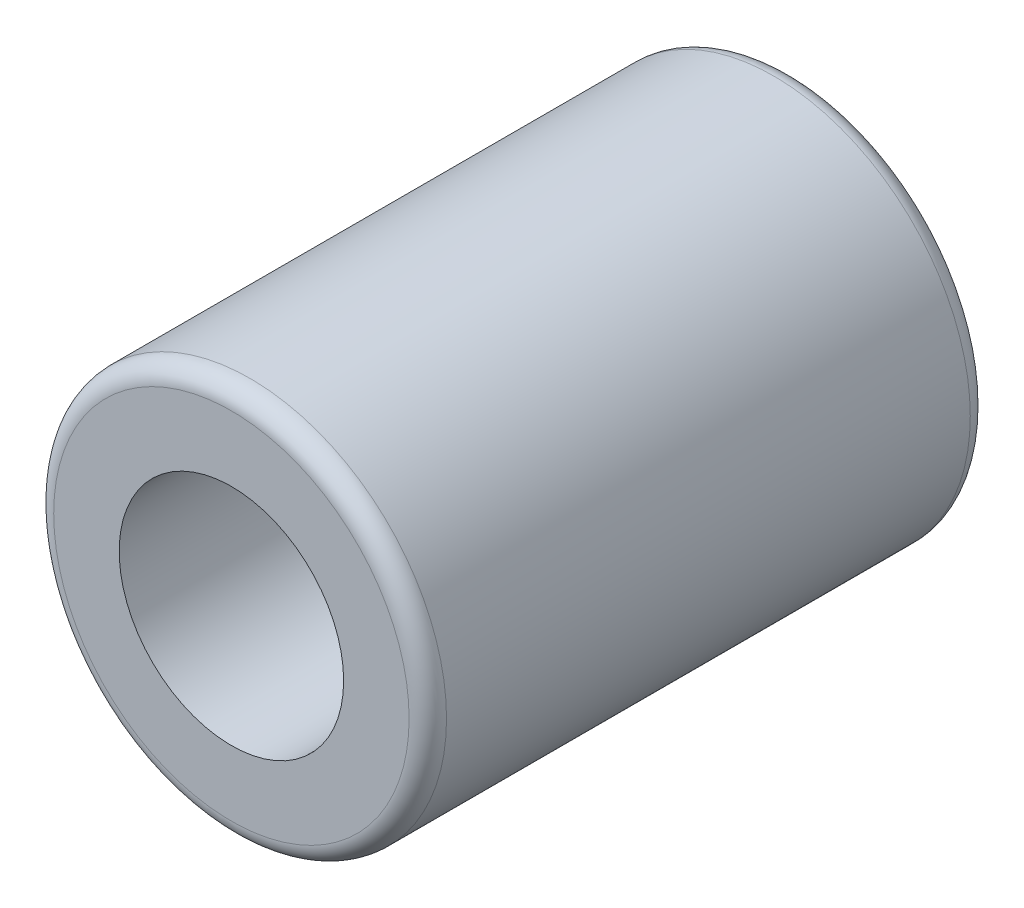
ISO-10303-21;
HEADER;
FILE_DESCRIPTION(('STEP AP214'),'2;1');
FILE_NAME('part.step','',(''),(''),'','','');
FILE_SCHEMA(('AUTOMOTIVE_DESIGN { 1 0 10303 214 1 1 1 1 }'));
ENDSEC;
DATA;
#1=APPLICATION_CONTEXT('core data for automotive mechanical design processes');
#2=APPLICATION_PROTOCOL_DEFINITION('international standard','automotive_design',2000,#1);
#3=PRODUCT_CONTEXT('',#1,'mechanical');
#4=PRODUCT('Part','Part','',(#3));
#5=PRODUCT_RELATED_PRODUCT_CATEGORY('part','',(#4));
#6=PRODUCT_DEFINITION_FORMATION('','',#4);
#7=PRODUCT_DEFINITION_CONTEXT('part definition',#1,'design');
#8=PRODUCT_DEFINITION('design','',#6,#7);
#9=PRODUCT_DEFINITION_SHAPE('','',#8);
#10=(LENGTH_UNIT() NAMED_UNIT(*) SI_UNIT(.MILLI.,.METRE.));
#11=(NAMED_UNIT(*) PLANE_ANGLE_UNIT() SI_UNIT($,.RADIAN.));
#12=(NAMED_UNIT(*) SI_UNIT($,.STERADIAN.) SOLID_ANGLE_UNIT());
#13=UNCERTAINTY_MEASURE_WITH_UNIT(LENGTH_MEASURE(1.E-05),#10,'distance_accuracy_value','');
#14=(GEOMETRIC_REPRESENTATION_CONTEXT(3) GLOBAL_UNCERTAINTY_ASSIGNED_CONTEXT((#13)) GLOBAL_UNIT_ASSIGNED_CONTEXT((#10,
#11,#12)) REPRESENTATION_CONTEXT('',''));
#15=CARTESIAN_POINT('',(0.,0.,0.));
#16=DIRECTION('',(0.,0.,1.));
#17=DIRECTION('',(1.,0.,0.));
#18=AXIS2_PLACEMENT_3D('',#15,#16,#17);
#19=CARTESIAN_POINT('',(0.,0.,30.));
#20=DIRECTION('',(0.,0.,1.));
#21=DIRECTION('',(1.,0.,0.));
#22=AXIS2_PLACEMENT_3D('',#19,#20,#21);
#23=PLANE('',#22);
#24=CARTESIAN_POINT('',(0.,0.,30.));
#25=DIRECTION('',(0.,0.,1.));
#26=DIRECTION('',(1.,0.,0.));
#27=AXIS2_PLACEMENT_3D('',#24,#25,#26);
#28=CIRCLE('',#27,9.5);
#29=CARTESIAN_POINT('',(9.5,0.,30.));
#30=VERTEX_POINT('',#29);
#31=EDGE_CURVE('E60',#30,#30,#28,.T.);
#32=ORIENTED_EDGE('',*,*,#31,.T.);
#33=EDGE_LOOP('',(#32));
#34=FACE_BOUND('',#33,.T.);
#35=CARTESIAN_POINT('',(0.,0.,30.));
#36=DIRECTION('',(0.,0.,1.));
#37=DIRECTION('',(1.,0.,0.));
#38=AXIS2_PLACEMENT_3D('',#35,#36,#37);
#39=CIRCLE('',#38,6.);
#40=CARTESIAN_POINT('',(6.,0.,30.));
#41=VERTEX_POINT('',#40);
#42=EDGE_CURVE('E65',#41,#41,#39,.T.);
#43=ORIENTED_EDGE('',*,*,#42,.F.);
#44=EDGE_LOOP('',(#43));
#45=FACE_BOUND('',#44,.T.);
#46=ADVANCED_FACE('F45',(#34,#45),#23,.T.);
#47=CARTESIAN_POINT('',(0.,0.,0.));
#48=DIRECTION('',(0.,0.,1.));
#49=DIRECTION('',(1.,0.,0.));
#50=AXIS2_PLACEMENT_3D('',#47,#48,#49);
#51=PLANE('',#50);
#52=CARTESIAN_POINT('',(0.,0.,0.));
#53=DIRECTION('',(0.,0.,1.));
#54=DIRECTION('',(1.,0.,0.));
#55=AXIS2_PLACEMENT_3D('',#52,#53,#54);
#56=CIRCLE('',#55,9.5);
#57=CARTESIAN_POINT('',(9.5,0.,0.));
#58=VERTEX_POINT('',#57);
#59=EDGE_CURVE('E10',#58,#58,#56,.F.);
#60=ORIENTED_EDGE('',*,*,#59,.T.);
#61=EDGE_LOOP('',(#60));
#62=FACE_BOUND('',#61,.T.);
#63=CARTESIAN_POINT('',(0.,0.,0.));
#64=DIRECTION('',(0.,0.,1.));
#65=DIRECTION('',(1.,0.,0.));
#66=AXIS2_PLACEMENT_3D('',#63,#64,#65);
#67=CIRCLE('',#66,6.);
#68=CARTESIAN_POINT('',(6.,0.,0.));
#69=VERTEX_POINT('',#68);
#70=EDGE_CURVE('E66',#69,#69,#67,.T.);
#71=ORIENTED_EDGE('',*,*,#70,.T.);
#72=EDGE_LOOP('',(#71));
#73=FACE_BOUND('',#72,.T.);
#74=ADVANCED_FACE('F76',(#62,#73),#51,.F.);
#75=CARTESIAN_POINT('',(0.,0.,30.));
#76=DIRECTION('',(0.,0.,-1.));
#77=DIRECTION('',(-1.,0.,0.));
#78=AXIS2_PLACEMENT_3D('',#75,#76,#77);
#79=CYLINDRICAL_SURFACE('',#78,10.5);
#80=CARTESIAN_POINT('',(0.,0.,29.));
#81=DIRECTION('',(0.,0.,1.));
#82=DIRECTION('',(1.,0.,0.));
#83=AXIS2_PLACEMENT_3D('',#80,#81,#82);
#84=CIRCLE('',#83,10.5);
#85=CARTESIAN_POINT('',(10.5,0.,29.));
#86=VERTEX_POINT('',#85);
#87=EDGE_CURVE('E52',#86,#86,#84,.F.);
#88=ORIENTED_EDGE('',*,*,#87,.T.);
#89=EDGE_LOOP('',(#88));
#90=FACE_BOUND('',#89,.T.);
#91=CARTESIAN_POINT('',(0.,0.,1.));
#92=DIRECTION('',(0.,0.,1.));
#93=DIRECTION('',(1.,0.,0.));
#94=AXIS2_PLACEMENT_3D('',#91,#92,#93);
#95=CIRCLE('',#94,10.5);
#96=CARTESIAN_POINT('',(10.5,0.,1.));
#97=VERTEX_POINT('',#96);
#98=EDGE_CURVE('E56',#97,#97,#95,.T.);
#99=ORIENTED_EDGE('',*,*,#98,.T.);
#100=EDGE_LOOP('',(#99));
#101=FACE_BOUND('',#100,.T.);
#102=ADVANCED_FACE('F82',(#90,#101),#79,.T.);
#103=CARTESIAN_POINT('',(0.,0.,30.));
#104=DIRECTION('',(0.,0.,-1.));
#105=DIRECTION('',(-1.,0.,0.));
#106=AXIS2_PLACEMENT_3D('',#103,#104,#105);
#107=CYLINDRICAL_SURFACE('',#106,6.);
#108=ORIENTED_EDGE('',*,*,#42,.T.);
#109=EDGE_LOOP('',(#108));
#110=FACE_BOUND('',#109,.T.);
#111=ORIENTED_EDGE('',*,*,#70,.F.);
#112=EDGE_LOOP('',(#111));
#113=FACE_BOUND('',#112,.T.);
#114=ADVANCED_FACE('F72',(#110,#113),#107,.F.);
#115=CARTESIAN_POINT('',(0.,0.,29.));
#116=DIRECTION('',(0.,0.,1.));
#117=DIRECTION('',(1.,0.,0.));
#118=AXIS2_PLACEMENT_3D('',#115,#116,#117);
#119=TOROIDAL_SURFACE('',#118,9.5,1.);
#120=ORIENTED_EDGE('',*,*,#87,.F.);
#121=EDGE_LOOP('',(#120));
#122=FACE_BOUND('',#121,.T.);
#123=ORIENTED_EDGE('',*,*,#31,.F.);
#124=EDGE_LOOP('',(#123));
#125=FACE_BOUND('',#124,.T.);
#126=ADVANCED_FACE('F87',(#122,#125),#119,.T.);
#127=CARTESIAN_POINT('',(0.,0.,1.));
#128=DIRECTION('',(0.,0.,1.));
#129=DIRECTION('',(1.,0.,0.));
#130=AXIS2_PLACEMENT_3D('',#127,#128,#129);
#131=TOROIDAL_SURFACE('',#130,9.5,1.);
#132=ORIENTED_EDGE('',*,*,#59,.F.);
#133=EDGE_LOOP('',(#132));
#134=FACE_BOUND('',#133,.T.);
#135=ORIENTED_EDGE('',*,*,#98,.F.);
#136=EDGE_LOOP('',(#135));
#137=FACE_BOUND('',#136,.T.);
#138=ADVANCED_FACE('F47',(#134,#137),#131,.T.);
#139=CLOSED_SHELL('',(#46,#74,#102,#114,#126,#138));
#140=MANIFOLD_SOLID_BREP('B2',#139);
#141=ADVANCED_BREP_SHAPE_REPRESENTATION('',(#18,#140),#14);
#142=SHAPE_DEFINITION_REPRESENTATION(#9,#141);
ENDSEC;
END-ISO-10303-21;
